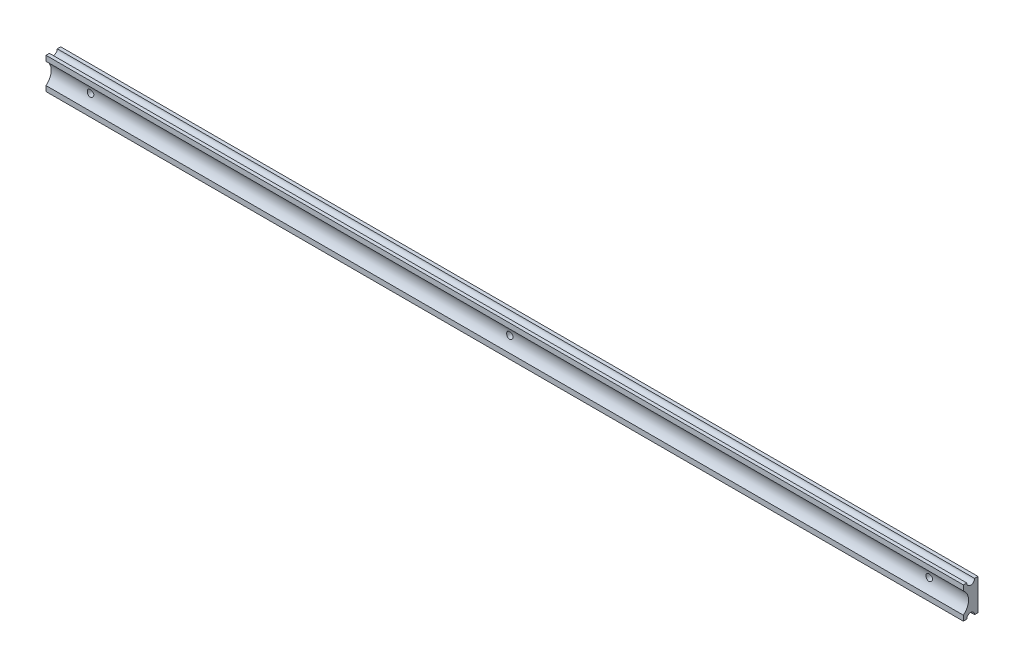
ISO-10303-21;
HEADER;
FILE_DESCRIPTION(('STEP AP214'),'2;1');
FILE_NAME('part.step','',(''),(''),'','','');
FILE_SCHEMA(('AUTOMOTIVE_DESIGN { 1 0 10303 214 1 1 1 1 }'));
ENDSEC;
DATA;
#1=APPLICATION_CONTEXT('core data for automotive mechanical design processes');
#2=APPLICATION_PROTOCOL_DEFINITION('international standard','automotive_design',2000,#1);
#3=PRODUCT_CONTEXT('',#1,'mechanical');
#4=PRODUCT('Part','Part','',(#3));
#5=PRODUCT_RELATED_PRODUCT_CATEGORY('part','',(#4));
#6=PRODUCT_DEFINITION_FORMATION('','',#4);
#7=PRODUCT_DEFINITION_CONTEXT('part definition',#1,'design');
#8=PRODUCT_DEFINITION('design','',#6,#7);
#9=PRODUCT_DEFINITION_SHAPE('','',#8);
#10=(LENGTH_UNIT() NAMED_UNIT(*) SI_UNIT(.MILLI.,.METRE.));
#11=(NAMED_UNIT(*) PLANE_ANGLE_UNIT() SI_UNIT($,.RADIAN.));
#12=(NAMED_UNIT(*) SI_UNIT($,.STERADIAN.) SOLID_ANGLE_UNIT());
#13=UNCERTAINTY_MEASURE_WITH_UNIT(LENGTH_MEASURE(1.E-05),#10,'distance_accuracy_value','');
#14=(GEOMETRIC_REPRESENTATION_CONTEXT(3) GLOBAL_UNCERTAINTY_ASSIGNED_CONTEXT((#13)) GLOBAL_UNIT_ASSIGNED_CONTEXT((#10,
#11,#12)) REPRESENTATION_CONTEXT('',''));
#15=CARTESIAN_POINT('',(0.,0.,0.));
#16=DIRECTION('',(0.,0.,1.));
#17=DIRECTION('',(1.,0.,0.));
#18=AXIS2_PLACEMENT_3D('',#15,#16,#17);
#19=CARTESIAN_POINT('',(175.,-6.,0.));
#20=DIRECTION('',(0.,0.,-1.));
#21=DIRECTION('',(-1.,0.,0.));
#22=AXIS2_PLACEMENT_3D('',#19,#20,#21);
#23=PLANE('',#22);
#24=DIRECTION('',(0.,-1.,0.));
#25=VECTOR('',#24,1.);
#26=CARTESIAN_POINT('',(-175.,-6.,0.));
#27=LINE('',#26,#25);
#28=CARTESIAN_POINT('',(-175.,6.,0.));
#29=VERTEX_POINT('',#28);
#30=CARTESIAN_POINT('',(-175.,4.,0.));
#31=VERTEX_POINT('',#30);
#32=EDGE_CURVE('E195',#29,#31,#27,.T.);
#33=ORIENTED_EDGE('',*,*,#32,.T.);
#34=DIRECTION('',(1.,0.,0.));
#35=VECTOR('',#34,1.);
#36=CARTESIAN_POINT('',(-175.,4.,0.));
#37=LINE('',#36,#35);
#38=CARTESIAN_POINT('',(175.,4.,0.));
#39=VERTEX_POINT('',#38);
#40=EDGE_CURVE('E115',#31,#39,#37,.T.);
#41=ORIENTED_EDGE('',*,*,#40,.T.);
#42=DIRECTION('',(0.,-1.,0.));
#43=VECTOR('',#42,1.);
#44=CARTESIAN_POINT('',(175.,-6.,0.));
#45=LINE('',#44,#43);
#46=CARTESIAN_POINT('',(175.,6.,0.));
#47=VERTEX_POINT('',#46);
#48=EDGE_CURVE('E242',#47,#39,#45,.T.);
#49=ORIENTED_EDGE('',*,*,#48,.F.);
#50=DIRECTION('',(-1.,0.,0.));
#51=VECTOR('',#50,1.);
#52=CARTESIAN_POINT('',(175.,6.,0.));
#53=LINE('',#52,#51);
#54=EDGE_CURVE('E217',#47,#29,#53,.T.);
#55=ORIENTED_EDGE('',*,*,#54,.T.);
#56=EDGE_LOOP('',(#33,#41,#49,#55));
#57=FACE_BOUND('',#56,.T.);
#58=ADVANCED_FACE('F95',(#57),#23,.F.);
#59=CARTESIAN_POINT('',(175.,6.,0.));
#60=DIRECTION('',(0.,-1.,0.));
#61=DIRECTION('',(0.,0.,-1.));
#62=AXIS2_PLACEMENT_3D('',#59,#60,#61);
#63=PLANE('',#62);
#64=DIRECTION('',(0.,0.,1.));
#65=VECTOR('',#64,1.);
#66=CARTESIAN_POINT('',(-175.,6.,0.));
#67=LINE('',#66,#65);
#68=CARTESIAN_POINT('',(-175.,6.,-5.6));
#69=VERTEX_POINT('',#68);
#70=CARTESIAN_POINT('',(-175.,6.,-4.3));
#71=VERTEX_POINT('',#70);
#72=EDGE_CURVE('E196',#69,#71,#67,.T.);
#73=ORIENTED_EDGE('',*,*,#72,.T.);
#74=DIRECTION('',(1.,0.,0.));
#75=VECTOR('',#74,1.);
#76=CARTESIAN_POINT('',(-175.,6.,-4.3));
#77=LINE('',#76,#75);
#78=CARTESIAN_POINT('',(175.,6.,-4.3));
#79=VERTEX_POINT('',#78);
#80=EDGE_CURVE('E227',#71,#79,#77,.T.);
#81=ORIENTED_EDGE('',*,*,#80,.T.);
#82=DIRECTION('',(0.,0.,1.));
#83=VECTOR('',#82,1.);
#84=CARTESIAN_POINT('',(175.,6.,0.));
#85=LINE('',#84,#83);
#86=CARTESIAN_POINT('',(175.,6.,-5.6));
#87=VERTEX_POINT('',#86);
#88=EDGE_CURVE('E240',#87,#79,#85,.T.);
#89=ORIENTED_EDGE('',*,*,#88,.F.);
#90=DIRECTION('',(-1.,0.,0.));
#91=VECTOR('',#90,1.);
#92=CARTESIAN_POINT('',(175.,6.,-5.6));
#93=LINE('',#92,#91);
#94=EDGE_CURVE('E208',#87,#69,#93,.T.);
#95=ORIENTED_EDGE('',*,*,#94,.T.);
#96=EDGE_LOOP('',(#73,#81,#89,#95));
#97=FACE_BOUND('',#96,.T.);
#98=ADVANCED_FACE('F258',(#97),#63,.F.);
#99=CARTESIAN_POINT('',(175.,-6.,-5.6));
#100=DIRECTION('',(0.,1.,0.));
#101=DIRECTION('',(0.,0.,1.));
#102=AXIS2_PLACEMENT_3D('',#99,#100,#101);
#103=PLANE('',#102);
#104=DIRECTION('',(0.,0.,-1.));
#105=VECTOR('',#104,1.);
#106=CARTESIAN_POINT('',(-175.,-6.,-5.6));
#107=LINE('',#106,#105);
#108=CARTESIAN_POINT('',(-175.,-6.,0.));
#109=VERTEX_POINT('',#108);
#110=CARTESIAN_POINT('',(-175.,-6.,-1.3));
#111=VERTEX_POINT('',#110);
#112=EDGE_CURVE('E194',#109,#111,#107,.T.);
#113=ORIENTED_EDGE('',*,*,#112,.T.);
#114=DIRECTION('',(1.,0.,0.));
#115=VECTOR('',#114,1.);
#116=CARTESIAN_POINT('',(-175.,-6.,-1.3));
#117=LINE('',#116,#115);
#118=CARTESIAN_POINT('',(175.,-6.,-1.3));
#119=VERTEX_POINT('',#118);
#120=EDGE_CURVE('E123',#111,#119,#117,.T.);
#121=ORIENTED_EDGE('',*,*,#120,.T.);
#122=DIRECTION('',(0.,0.,-1.));
#123=VECTOR('',#122,1.);
#124=CARTESIAN_POINT('',(175.,-6.,-5.6));
#125=LINE('',#124,#123);
#126=CARTESIAN_POINT('',(175.,-6.,0.));
#127=VERTEX_POINT('',#126);
#128=EDGE_CURVE('E246',#127,#119,#125,.T.);
#129=ORIENTED_EDGE('',*,*,#128,.F.);
#130=DIRECTION('',(-1.,0.,0.));
#131=VECTOR('',#130,1.);
#132=CARTESIAN_POINT('',(175.,-6.,0.));
#133=LINE('',#132,#131);
#134=EDGE_CURVE('E215',#127,#109,#133,.T.);
#135=ORIENTED_EDGE('',*,*,#134,.T.);
#136=EDGE_LOOP('',(#113,#121,#129,#135));
#137=FACE_BOUND('',#136,.T.);
#138=ADVANCED_FACE('F260',(#137),#103,.F.);
#139=CARTESIAN_POINT('',(175.,6.,-1.3));
#140=VERTEX_POINT('',#139);
#141=EDGE_CURVE('E207',#140,#47,#85,.T.);
#142=ORIENTED_EDGE('',*,*,#141,.F.);
#143=DIRECTION('',(1.,0.,0.));
#144=VECTOR('',#143,1.);
#145=CARTESIAN_POINT('',(-175.,6.,-1.3));
#146=LINE('',#145,#144);
#147=CARTESIAN_POINT('',(-175.,6.,-1.3));
#148=VERTEX_POINT('',#147);
#149=EDGE_CURVE('E224',#140,#148,#146,.F.);
#150=ORIENTED_EDGE('',*,*,#149,.T.);
#151=EDGE_CURVE('E200',#148,#29,#67,.T.);
#152=ORIENTED_EDGE('',*,*,#151,.T.);
#153=ORIENTED_EDGE('',*,*,#54,.F.);
#154=EDGE_LOOP('',(#142,#150,#152,#153));
#155=FACE_BOUND('',#154,.T.);
#156=ADVANCED_FACE('F97',(#155),#63,.F.);
#157=CARTESIAN_POINT('',(175.,-4.,0.));
#158=VERTEX_POINT('',#157);
#159=EDGE_CURVE('E188',#158,#127,#45,.T.);
#160=ORIENTED_EDGE('',*,*,#159,.F.);
#161=DIRECTION('',(1.,0.,0.));
#162=VECTOR('',#161,1.);
#163=CARTESIAN_POINT('',(-175.,-4.,0.));
#164=LINE('',#163,#162);
#165=CARTESIAN_POINT('',(-175.,-4.,0.));
#166=VERTEX_POINT('',#165);
#167=EDGE_CURVE('E176',#158,#166,#164,.F.);
#168=ORIENTED_EDGE('',*,*,#167,.T.);
#169=EDGE_CURVE('E186',#166,#109,#27,.T.);
#170=ORIENTED_EDGE('',*,*,#169,.T.);
#171=ORIENTED_EDGE('',*,*,#134,.F.);
#172=EDGE_LOOP('',(#160,#168,#170,#171));
#173=FACE_BOUND('',#172,.T.);
#174=ADVANCED_FACE('F184',(#173),#23,.F.);
#175=CARTESIAN_POINT('',(175.,-6.,-4.3));
#176=VERTEX_POINT('',#175);
#177=CARTESIAN_POINT('',(175.,-6.,-5.6));
#178=VERTEX_POINT('',#177);
#179=EDGE_CURVE('E245',#176,#178,#125,.T.);
#180=ORIENTED_EDGE('',*,*,#179,.F.);
#181=DIRECTION('',(1.,0.,0.));
#182=VECTOR('',#181,1.);
#183=CARTESIAN_POINT('',(-175.,-6.,-4.3));
#184=LINE('',#183,#182);
#185=CARTESIAN_POINT('',(-175.,-6.,-4.3));
#186=VERTEX_POINT('',#185);
#187=EDGE_CURVE('E322',#176,#186,#184,.F.);
#188=ORIENTED_EDGE('',*,*,#187,.T.);
#189=CARTESIAN_POINT('',(-175.,-6.,-5.6));
#190=VERTEX_POINT('',#189);
#191=EDGE_CURVE('E198',#186,#190,#107,.T.);
#192=ORIENTED_EDGE('',*,*,#191,.T.);
#193=DIRECTION('',(-1.,0.,0.));
#194=VECTOR('',#193,1.);
#195=CARTESIAN_POINT('',(175.,-6.,-5.6));
#196=LINE('',#195,#194);
#197=EDGE_CURVE('E211',#178,#190,#196,.T.);
#198=ORIENTED_EDGE('',*,*,#197,.F.);
#199=EDGE_LOOP('',(#180,#188,#192,#198));
#200=FACE_BOUND('',#199,.T.);
#201=ADVANCED_FACE('F267',(#200),#103,.F.);
#202=CARTESIAN_POINT('',(175.,6.,-5.6));
#203=DIRECTION('',(0.,0.,1.));
#204=DIRECTION('',(0.,-1.,0.));
#205=AXIS2_PLACEMENT_3D('',#202,#203,#204);
#206=PLANE('',#205);
#207=CARTESIAN_POINT('',(0.,0.,-5.6));
#208=DIRECTION('',(0.,0.,-1.));
#209=DIRECTION('',(0.,1.,0.));
#210=AXIS2_PLACEMENT_3D('',#207,#208,#209);
#211=CIRCLE('',#210,1.24999999999997);
#212=CARTESIAN_POINT('',(0.,1.24999999999997,-5.6));
#213=VERTEX_POINT('',#212);
#214=EDGE_CURVE('E310',#213,#213,#211,.T.);
#215=ORIENTED_EDGE('',*,*,#214,.F.);
#216=EDGE_LOOP('',(#215));
#217=FACE_BOUND('',#216,.T.);
#218=CARTESIAN_POINT('',(-160.,0.,-5.6));
#219=DIRECTION('',(0.,0.,-1.));
#220=DIRECTION('',(0.,1.,0.));
#221=AXIS2_PLACEMENT_3D('',#218,#219,#220);
#222=CIRCLE('',#221,1.24999999999997);
#223=CARTESIAN_POINT('',(-160.,1.24999999999997,-5.6));
#224=VERTEX_POINT('',#223);
#225=EDGE_CURVE('E311',#224,#224,#222,.T.);
#226=ORIENTED_EDGE('',*,*,#225,.F.);
#227=EDGE_LOOP('',(#226));
#228=FACE_BOUND('',#227,.T.);
#229=CARTESIAN_POINT('',(160.,0.,-5.6));
#230=DIRECTION('',(0.,0.,-1.));
#231=DIRECTION('',(0.,1.,0.));
#232=AXIS2_PLACEMENT_3D('',#229,#230,#231);
#233=CIRCLE('',#232,1.24999999999997);
#234=CARTESIAN_POINT('',(160.,1.24999999999997,-5.6));
#235=VERTEX_POINT('',#234);
#236=EDGE_CURVE('E313',#235,#235,#233,.T.);
#237=ORIENTED_EDGE('',*,*,#236,.F.);
#238=EDGE_LOOP('',(#237));
#239=FACE_BOUND('',#238,.T.);
#240=DIRECTION('',(0.,1.,0.));
#241=VECTOR('',#240,1.);
#242=CARTESIAN_POINT('',(-175.,6.,-5.6));
#243=LINE('',#242,#241);
#244=EDGE_CURVE('E205',#190,#69,#243,.T.);
#245=ORIENTED_EDGE('',*,*,#244,.T.);
#246=ORIENTED_EDGE('',*,*,#94,.F.);
#247=DIRECTION('',(0.,1.,0.));
#248=VECTOR('',#247,1.);
#249=CARTESIAN_POINT('',(175.,6.,-5.6));
#250=LINE('',#249,#248);
#251=EDGE_CURVE('E212',#178,#87,#250,.T.);
#252=ORIENTED_EDGE('',*,*,#251,.F.);
#253=ORIENTED_EDGE('',*,*,#197,.T.);
#254=EDGE_LOOP('',(#245,#246,#252,#253));
#255=FACE_BOUND('',#254,.T.);
#256=ADVANCED_FACE('F256',(#217,#228,#239,#255),#206,.F.);
#257=CARTESIAN_POINT('',(175.,0.,0.));
#258=DIRECTION('',(-1.,0.,0.));
#259=DIRECTION('',(0.,0.,1.));
#260=AXIS2_PLACEMENT_3D('',#257,#258,#259);
#261=PLANE('',#260);
#262=ORIENTED_EDGE('',*,*,#48,.T.);
#263=CARTESIAN_POINT('',(175.,0.,3.));
#264=DIRECTION('',(1.,0.,0.));
#265=DIRECTION('',(0.,0.,-1.));
#266=AXIS2_PLACEMENT_3D('',#263,#264,#265);
#267=CIRCLE('',#266,5.);
#268=EDGE_CURVE('E189',#158,#39,#267,.T.);
#269=ORIENTED_EDGE('',*,*,#268,.F.);
#270=ORIENTED_EDGE('',*,*,#159,.T.);
#271=ORIENTED_EDGE('',*,*,#128,.T.);
#272=CARTESIAN_POINT('',(175.,-6.,-2.8));
#273=DIRECTION('',(1.,0.,0.));
#274=DIRECTION('',(0.,0.,-1.));
#275=AXIS2_PLACEMENT_3D('',#272,#273,#274);
#276=CIRCLE('',#275,1.5);
#277=EDGE_CURVE('E319',#176,#119,#276,.T.);
#278=ORIENTED_EDGE('',*,*,#277,.F.);
#279=ORIENTED_EDGE('',*,*,#179,.T.);
#280=ORIENTED_EDGE('',*,*,#251,.T.);
#281=ORIENTED_EDGE('',*,*,#88,.T.);
#282=CARTESIAN_POINT('',(175.,6.,-2.8));
#283=DIRECTION('',(1.,0.,0.));
#284=DIRECTION('',(0.,0.,-1.));
#285=AXIS2_PLACEMENT_3D('',#282,#283,#284);
#286=CIRCLE('',#285,1.5);
#287=EDGE_CURVE('E320',#140,#79,#286,.T.);
#288=ORIENTED_EDGE('',*,*,#287,.F.);
#289=ORIENTED_EDGE('',*,*,#141,.T.);
#290=EDGE_LOOP('',(#262,#269,#270,#271,#278,#279,#280,#281,#288,#289));
#291=FACE_BOUND('',#290,.T.);
#292=ADVANCED_FACE('F251',(#291),#261,.F.);
#293=CARTESIAN_POINT('',(-175.,0.,0.));
#294=DIRECTION('',(-1.,0.,0.));
#295=DIRECTION('',(0.,0.,1.));
#296=AXIS2_PLACEMENT_3D('',#293,#294,#295);
#297=PLANE('',#296);
#298=CARTESIAN_POINT('',(-175.,0.,3.));
#299=DIRECTION('',(-1.,0.,0.));
#300=DIRECTION('',(0.,0.,1.));
#301=AXIS2_PLACEMENT_3D('',#298,#299,#300);
#302=CIRCLE('',#301,5.);
#303=EDGE_CURVE('E49',#31,#166,#302,.T.);
#304=ORIENTED_EDGE('',*,*,#303,.F.);
#305=ORIENTED_EDGE('',*,*,#32,.F.);
#306=ORIENTED_EDGE('',*,*,#151,.F.);
#307=CARTESIAN_POINT('',(-175.,6.,-2.8));
#308=DIRECTION('',(-1.,0.,0.));
#309=DIRECTION('',(0.,0.,1.));
#310=AXIS2_PLACEMENT_3D('',#307,#308,#309);
#311=CIRCLE('',#310,1.5);
#312=EDGE_CURVE('E109',#71,#148,#311,.T.);
#313=ORIENTED_EDGE('',*,*,#312,.F.);
#314=ORIENTED_EDGE('',*,*,#72,.F.);
#315=ORIENTED_EDGE('',*,*,#244,.F.);
#316=ORIENTED_EDGE('',*,*,#191,.F.);
#317=CARTESIAN_POINT('',(-175.,-6.,-2.8));
#318=DIRECTION('',(1.,0.,0.));
#319=DIRECTION('',(0.,0.,-1.));
#320=AXIS2_PLACEMENT_3D('',#317,#318,#319);
#321=CIRCLE('',#320,1.5);
#322=EDGE_CURVE('E323',#186,#111,#321,.T.);
#323=ORIENTED_EDGE('',*,*,#322,.T.);
#324=ORIENTED_EDGE('',*,*,#112,.F.);
#325=ORIENTED_EDGE('',*,*,#169,.F.);
#326=EDGE_LOOP('',(#304,#305,#306,#313,#314,#315,#316,#323,#324,#325));
#327=FACE_BOUND('',#326,.T.);
#328=ADVANCED_FACE('F192',(#327),#297,.T.);
#329=CARTESIAN_POINT('',(-175.,-6.,-2.8));
#330=DIRECTION('',(1.,0.,0.));
#331=DIRECTION('',(0.,0.,-1.));
#332=AXIS2_PLACEMENT_3D('',#329,#330,#331);
#333=CYLINDRICAL_SURFACE('',#332,1.5);
#334=ORIENTED_EDGE('',*,*,#322,.F.);
#335=ORIENTED_EDGE('',*,*,#187,.F.);
#336=ORIENTED_EDGE('',*,*,#277,.T.);
#337=ORIENTED_EDGE('',*,*,#120,.F.);
#338=EDGE_LOOP('',(#334,#335,#336,#337));
#339=FACE_BOUND('',#338,.T.);
#340=ADVANCED_FACE('F283',(#339),#333,.F.);
#341=CARTESIAN_POINT('',(-175.,6.,-2.8));
#342=DIRECTION('',(1.,0.,0.));
#343=DIRECTION('',(0.,0.,-1.));
#344=AXIS2_PLACEMENT_3D('',#341,#342,#343);
#345=CYLINDRICAL_SURFACE('',#344,1.5);
#346=ORIENTED_EDGE('',*,*,#312,.T.);
#347=ORIENTED_EDGE('',*,*,#149,.F.);
#348=ORIENTED_EDGE('',*,*,#287,.T.);
#349=ORIENTED_EDGE('',*,*,#80,.F.);
#350=EDGE_LOOP('',(#346,#347,#348,#349));
#351=FACE_BOUND('',#350,.T.);
#352=ADVANCED_FACE('F223',(#351),#345,.F.);
#353=CARTESIAN_POINT('',(-175.,0.,3.));
#354=DIRECTION('',(1.,0.,0.));
#355=DIRECTION('',(0.,0.,-1.));
#356=AXIS2_PLACEMENT_3D('',#353,#354,#355);
#357=CYLINDRICAL_SURFACE('',#356,5.);
#358=CARTESIAN_POINT('',(0.,1.24999999999999,-1.84122918275928));
#359=CARTESIAN_POINT('',(0.0690253754622762,1.24999803929588,-1.84123050042654));
#360=CARTESIAN_POINT('',(0.138072449338968,1.24426312274864,-1.84272153006957));
#361=CARTESIAN_POINT('',(0.274183789086987,1.22151156273206,-1.84850930996625));
#362=CARTESIAN_POINT('',(0.341246877234131,1.20448835337109,-1.85280769310907));
#363=CARTESIAN_POINT('',(0.471401769093487,1.15974559981596,-1.86369362297984));
#364=CARTESIAN_POINT('',(0.534498577692802,1.13203986392722,-1.87027821345205));
#365=CARTESIAN_POINT('',(0.655155426269927,1.06676057063069,-1.88499096014404));
#366=CARTESIAN_POINT('',(0.71271523104008,1.02918659428033,-1.89311918189251));
#367=CARTESIAN_POINT('',(0.821930822631068,0.944354213655925,-1.91020358177806));
#368=CARTESIAN_POINT('',(0.873446800174988,0.896918443852012,-1.91917298811516));
#369=CARTESIAN_POINT('',(0.967880697180139,0.794091032050319,-1.93681437757649));
#370=CARTESIAN_POINT('',(1.01079781281084,0.73869864709014,-1.94548633283195));
#371=CARTESIAN_POINT('',(1.08738773381561,0.620572600539462,-1.96170207760291));
#372=CARTESIAN_POINT('',(1.1209231940807,0.557747288097545,-1.96922843700296));
#373=CARTESIAN_POINT('',(1.17690482207651,0.427131592146369,-1.98215405962992));
#374=CARTESIAN_POINT('',(1.19935262595773,0.359341942895962,-1.98755363667172));
#375=CARTESIAN_POINT('',(1.23207391728926,0.222179379377077,-1.9955237942409));
#376=CARTESIAN_POINT('',(1.24258482216325,0.152866359774484,-1.99814946922157));
#377=CARTESIAN_POINT('',(1.25187918963773,0.0134144096313832,-2.00046797053649));
#378=CARTESIAN_POINT('',(1.25066438610475,-0.056724397269034,-2.00016123048352));
#379=CARTESIAN_POINT('',(1.23671257487488,-0.194190308965483,-1.99669047476767));
#380=CARTESIAN_POINT('',(1.22423183747303,-0.261545269501332,-1.99359001170437));
#381=CARTESIAN_POINT('',(1.18851436497571,-0.393172809267106,-1.98495418262427));
#382=CARTESIAN_POINT('',(1.16527705731126,-0.457445224213044,-1.97941868699221));
#383=CARTESIAN_POINT('',(1.10849871465643,-0.581758379377255,-1.96643754850448));
#384=CARTESIAN_POINT('',(1.07486647766909,-0.641755637208128,-1.95897509847527));
#385=CARTESIAN_POINT('',(0.998322160441827,-0.755344527925607,-1.94294951904825));
#386=CARTESIAN_POINT('',(0.955408465719641,-0.808935043856875,-1.93438619826245));
#387=CARTESIAN_POINT('',(0.860145629008761,-0.909717543856188,-1.9168185688476));
#388=CARTESIAN_POINT('',(0.807572553826068,-0.956697098843994,-1.90780859762959));
#389=CARTESIAN_POINT('',(0.695200013229834,-1.04122046995377,-1.89057521758353));
#390=CARTESIAN_POINT('',(0.63540021025446,-1.07876384505751,-1.88235184552985));
#391=CARTESIAN_POINT('',(0.509854982925479,-1.14348516127824,-1.86760248415824));
#392=CARTESIAN_POINT('',(0.444082134843364,-1.1706119587131,-1.86108491862861));
#393=CARTESIAN_POINT('',(0.308707265961736,-1.21335702579542,-1.85059320069979));
#394=CARTESIAN_POINT('',(0.239106068008393,-1.22897775819113,-1.8466185040511));
#395=CARTESIAN_POINT('',(0.100020249238406,-1.24791481933258,-1.84177678019571));
#396=CARTESIAN_POINT('',(0.0305811033351569,-1.2515452369598,-1.84083044546824));
#397=CARTESIAN_POINT('',(-0.107910968289097,-1.24725849525776,-1.8419367174052));
#398=CARTESIAN_POINT('',(-0.176963928975632,-1.23934239892439,-1.84398904800633));
#399=CARTESIAN_POINT('',(-0.311557132477361,-1.21246273196882,-1.85078540977281));
#400=CARTESIAN_POINT('',(-0.37713636328543,-1.19368203414086,-1.85548485117188));
#401=CARTESIAN_POINT('',(-0.504215728925852,-1.1458090408353,-1.86700359135481));
#402=CARTESIAN_POINT('',(-0.565715379527681,-1.11671552385626,-1.87382314124307));
#403=CARTESIAN_POINT('',(-0.684220638933688,-1.04838533396827,-1.88898068546632));
#404=CARTESIAN_POINT('',(-0.741114420021567,-1.0089608769178,-1.89734584303321));
#405=CARTESIAN_POINT('',(-0.847594181400698,-0.921325366168061,-1.91458541535858));
#406=CARTESIAN_POINT('',(-0.897178958325061,-0.873112868506792,-1.92345991364235));
#407=CARTESIAN_POINT('',(-0.988905521285502,-0.7678284012309,-1.94098701515803));
#408=CARTESIAN_POINT('',(-1.03083003127443,-0.710564940664483,-1.94962851030918));
#409=CARTESIAN_POINT('',(-1.10446793347564,-0.589628353368334,-1.96548608306867));
#410=CARTESIAN_POINT('',(-1.13618185830411,-0.525955561196977,-1.9727022350198));
#411=CARTESIAN_POINT('',(-1.18822301726398,-0.39444775216385,-1.98485057869157));
#412=CARTESIAN_POINT('',(-1.20863214218955,-0.326646726284839,-1.98979915011205));
#413=CARTESIAN_POINT('',(-1.23773016730423,-0.188437200398498,-1.99692646697894));
#414=CARTESIAN_POINT('',(-1.24642132936954,-0.118029206301543,-1.99910574696704));
#415=CARTESIAN_POINT('',(-1.25170948696943,0.0213544080541679,-2.00042711761014));
#416=CARTESIAN_POINT('',(-1.24862713636926,0.0903172837075495,-1.9996497360001));
#417=CARTESIAN_POINT('',(-1.2311902158821,0.226709370518428,-1.9953237057178));
#418=CARTESIAN_POINT('',(-1.21683598123363,0.29413862722611,-1.99177513946369));
#419=CARTESIAN_POINT('',(-1.17743472528634,0.425213794556018,-1.98231791067453));
#420=CARTESIAN_POINT('',(-1.15244568335673,0.48887811822627,-1.97642205628333));
#421=CARTESIAN_POINT('',(-1.09253677622586,0.61114631630183,-1.9628911114173));
#422=CARTESIAN_POINT('',(-1.05761565916307,0.669749551581308,-1.9552558017217));
#423=CARTESIAN_POINT('',(-0.977855957503687,0.781752410529868,-1.93884062101666));
#424=CARTESIAN_POINT('',(-0.9327998213658,0.834993735375724,-1.93003771182014));
#425=CARTESIAN_POINT('',(-0.834471435032762,0.933268775339063,-1.91238311316553));
#426=CARTESIAN_POINT('',(-0.781197104877622,0.978300406335232,-1.90353141190695));
#427=CARTESIAN_POINT('',(-0.666748232248338,1.05970253309903,-1.88659344825685));
#428=CARTESIAN_POINT('',(-0.605444845734225,1.09589577430818,-1.87852454662356));
#429=CARTESIAN_POINT('',(-0.477430637596644,1.15740862076957,-1.8642994443827));
#430=CARTESIAN_POINT('',(-0.410723792366597,1.18273613719963,-1.85814185308379));
#431=CARTESIAN_POINT('',(-0.286778735216634,1.21802816070678,-1.8493988592473));
#432=CARTESIAN_POINT('',(-0.230133544520203,1.22999146324421,-1.84635828750684));
#433=CARTESIAN_POINT('',(-0.115663913750074,1.24597786571657,-1.84227298231966));
#434=CARTESIAN_POINT('',(-0.0578395746937013,1.25000164296522,-1.84122807862454));
#435=CARTESIAN_POINT('',(0.,1.24999999999999,-1.84122918275928));
#436=B_SPLINE_CURVE_WITH_KNOTS('',3,(#358,#359,#360,#361,#362,#363,#364,#365,#366,#367,#368,
#369,#370,#371,#372,#373,#374,#375,#376,#377,#378,#379,#380,#381,#382,#383,#384,#385,#386,#387,
#388,#389,#390,#391,#392,#393,#394,#395,#396,#397,#398,#399,#400,#401,#402,#403,#404,#405,#406,
#407,#408,#409,#410,#411,#412,#413,#414,#415,#416,#417,#418,#419,#420,#421,#422,#423,#424,#425,
#426,#427,#428,#429,#430,#431,#432,#433,#434,#435),.UNSPECIFIED.,.T.,.F.,(4,2,2,2,2,2,2,2,2,2,2,
2,2,2,2,2,2,2,2,2,2,2,2,2,2,2,2,2,2,2,2,2,2,2,2,2,2,2,4),(0.,0.206863720868065,
0.413847870714328,0.620565363583005,0.827291633777386,1.03811977096488,1.24896760739933,
1.46275748198959,1.67651579923545,1.88594375497672,2.09534074333008,2.30009131344472,
2.50485278362391,2.7114643712722,2.91811192734455,3.13035233285954,3.34260265599898,
3.55588216004198,3.76911600064771,3.97671787380854,4.18430063591895,4.38848702504597,
4.59269760710703,4.80091422929574,5.00916509442517,5.22262665482654,5.43607707859771,
5.6479603640346,5.85980274454514,6.06591723063723,6.27202558688485,6.47702438279849,
6.68204902869028,6.89198548291029,7.10197515782749,7.31588238642332,7.52963360683301,
7.70298913588656,7.87632987549752),.UNSPECIFIED.);
#437=CARTESIAN_POINT('',(0.,1.24999999999999,-1.84122918275928));
#438=VERTEX_POINT('',#437);
#439=EDGE_CURVE('E316',#438,#438,#436,.T.);
#440=ORIENTED_EDGE('',*,*,#439,.T.);
#441=EDGE_LOOP('',(#440));
#442=FACE_BOUND('',#441,.T.);
#443=CARTESIAN_POINT('',(-160.,1.24999999999999,-1.84122918275928));
#444=CARTESIAN_POINT('',(-159.930974624538,1.24999803929588,-1.84123050042655));
#445=CARTESIAN_POINT('',(-159.861927550661,1.24426312274864,-1.84272153006957));
#446=CARTESIAN_POINT('',(-159.725816210913,1.22151156273206,-1.84850930996625));
#447=CARTESIAN_POINT('',(-159.658753122766,1.20448835337109,-1.85280769310907));
#448=CARTESIAN_POINT('',(-159.528598230907,1.15974559981596,-1.86369362297984));
#449=CARTESIAN_POINT('',(-159.465501422307,1.13203986392722,-1.87027821345205));
#450=CARTESIAN_POINT('',(-159.34484457373,1.06676057063069,-1.88499096014404));
#451=CARTESIAN_POINT('',(-159.28728476896,1.02918659428033,-1.89311918189251));
#452=CARTESIAN_POINT('',(-159.178069177369,0.944354213655927,-1.91020358177806));
#453=CARTESIAN_POINT('',(-159.126553199825,0.896918443852019,-1.91917298811515));
#454=CARTESIAN_POINT('',(-159.03211930282,0.794091032050326,-1.93681437757649));
#455=CARTESIAN_POINT('',(-158.989202187189,0.738698647090143,-1.94548633283195));
#456=CARTESIAN_POINT('',(-158.912612266184,0.620572600539462,-1.96170207760291));
#457=CARTESIAN_POINT('',(-158.879076805919,0.557747288097545,-1.96922843700296));
#458=CARTESIAN_POINT('',(-158.823095177924,0.427131592146371,-1.98215405962992));
#459=CARTESIAN_POINT('',(-158.800647374042,0.359341942895964,-1.98755363667172));
#460=CARTESIAN_POINT('',(-158.767926082711,0.222179379377078,-1.9955237942409));
#461=CARTESIAN_POINT('',(-158.757415177837,0.152866359774485,-1.99814946922157));
#462=CARTESIAN_POINT('',(-158.748120810362,0.0134144096313832,-2.00046797053649));
#463=CARTESIAN_POINT('',(-158.749335613895,-0.0567243972690333,-2.00016123048352));
#464=CARTESIAN_POINT('',(-158.763287425125,-0.194190308965484,-1.99669047476767));
#465=CARTESIAN_POINT('',(-158.775768162527,-0.261545269501337,-1.99359001170437));
#466=CARTESIAN_POINT('',(-158.811485635024,-0.393172809267111,-1.98495418262427));
#467=CARTESIAN_POINT('',(-158.834722942689,-0.457445224213046,-1.97941868699221));
#468=CARTESIAN_POINT('',(-158.891501285344,-0.581758379377256,-1.96643754850448));
#469=CARTESIAN_POINT('',(-158.925133522331,-0.64175563720813,-1.95897509847527));
#470=CARTESIAN_POINT('',(-159.001677839558,-0.755344527925608,-1.94294951904825));
#471=CARTESIAN_POINT('',(-159.04459153428,-0.808935043856875,-1.93438619826245));
#472=CARTESIAN_POINT('',(-159.139854370991,-0.909717543856184,-1.9168185688476));
#473=CARTESIAN_POINT('',(-159.192427446174,-0.956697098843989,-1.90780859762959));
#474=CARTESIAN_POINT('',(-159.30479998677,-1.04122046995377,-1.89057521758353));
#475=CARTESIAN_POINT('',(-159.364599789746,-1.07876384505751,-1.88235184552986));
#476=CARTESIAN_POINT('',(-159.490145017075,-1.14348516127823,-1.86760248415825));
#477=CARTESIAN_POINT('',(-159.555917865157,-1.1706119587131,-1.86108491862861));
#478=CARTESIAN_POINT('',(-159.691292734038,-1.21335702579541,-1.85059320069979));
#479=CARTESIAN_POINT('',(-159.760893931992,-1.22897775819113,-1.8466185040511));
#480=CARTESIAN_POINT('',(-159.899979750762,-1.24791481933258,-1.84177678019571));
#481=CARTESIAN_POINT('',(-159.969418896665,-1.2515452369598,-1.84083044546824));
#482=CARTESIAN_POINT('',(-160.107910968289,-1.24725849525776,-1.8419367174052));
#483=CARTESIAN_POINT('',(-160.176963928976,-1.23934239892439,-1.84398904800633));
#484=CARTESIAN_POINT('',(-160.311557132477,-1.21246273196882,-1.85078540977281));
#485=CARTESIAN_POINT('',(-160.377136363285,-1.19368203414086,-1.85548485117188));
#486=CARTESIAN_POINT('',(-160.504215728926,-1.1458090408353,-1.86700359135482));
#487=CARTESIAN_POINT('',(-160.565715379528,-1.11671552385626,-1.87382314124307));
#488=CARTESIAN_POINT('',(-160.684220638934,-1.04838533396827,-1.88898068546632));
#489=CARTESIAN_POINT('',(-160.741114420022,-1.0089608769178,-1.89734584303321));
#490=CARTESIAN_POINT('',(-160.847594181401,-0.921325366168058,-1.91458541535858));
#491=CARTESIAN_POINT('',(-160.897178958325,-0.873112868506789,-1.92345991364235));
#492=CARTESIAN_POINT('',(-160.988905521285,-0.7678284012309,-1.94098701515803));
#493=CARTESIAN_POINT('',(-161.030830031274,-0.710564940664485,-1.94962851030918));
#494=CARTESIAN_POINT('',(-161.104467933476,-0.589628353368337,-1.96548608306867));
#495=CARTESIAN_POINT('',(-161.136181858304,-0.525955561196979,-1.9727022350198));
#496=CARTESIAN_POINT('',(-161.188223017264,-0.39444775216385,-1.98485057869157));
#497=CARTESIAN_POINT('',(-161.20863214219,-0.326646726284838,-1.98979915011205));
#498=CARTESIAN_POINT('',(-161.237730167304,-0.188437200398497,-1.99692646697894));
#499=CARTESIAN_POINT('',(-161.24642132937,-0.118029206301542,-1.99910574696704));
#500=CARTESIAN_POINT('',(-161.251709486969,0.0213544080541674,-2.00042711761014));
#501=CARTESIAN_POINT('',(-161.248627136369,0.0903172837075491,-1.9996497360001));
#502=CARTESIAN_POINT('',(-161.231190215882,0.226709370518427,-1.9953237057178));
#503=CARTESIAN_POINT('',(-161.216835981234,0.294138627226108,-1.99177513946369));
#504=CARTESIAN_POINT('',(-161.177434725286,0.425213794556019,-1.98231791067453));
#505=CARTESIAN_POINT('',(-161.152445683357,0.488878118226275,-1.97642205628333));
#506=CARTESIAN_POINT('',(-161.092536776226,0.611146316301834,-1.9628911114173));
#507=CARTESIAN_POINT('',(-161.057615659163,0.669749551581308,-1.9552558017217));
#508=CARTESIAN_POINT('',(-160.977855957504,0.781752410529867,-1.93884062101666));
#509=CARTESIAN_POINT('',(-160.932799821366,0.834993735375726,-1.93003771182014));
#510=CARTESIAN_POINT('',(-160.834471435033,0.933268775339066,-1.91238311316553));
#511=CARTESIAN_POINT('',(-160.781197104878,0.978300406335233,-1.90353141190695));
#512=CARTESIAN_POINT('',(-160.666748232248,1.05970253309903,-1.88659344825685));
#513=CARTESIAN_POINT('',(-160.605444845734,1.09589577430818,-1.87852454662356));
#514=CARTESIAN_POINT('',(-160.477430637597,1.15740862076957,-1.8642994443827));
#515=CARTESIAN_POINT('',(-160.410723792367,1.18273613719963,-1.85814185308379));
#516=CARTESIAN_POINT('',(-160.286778735217,1.21802816070678,-1.8493988592473));
#517=CARTESIAN_POINT('',(-160.23013354452,1.22999146324421,-1.84635828750684));
#518=CARTESIAN_POINT('',(-160.11566391375,1.24597786571657,-1.84227298231966));
#519=CARTESIAN_POINT('',(-160.057839574694,1.25000164296522,-1.84122807862454));
#520=CARTESIAN_POINT('',(-160.,1.24999999999999,-1.84122918275928));
#521=B_SPLINE_CURVE_WITH_KNOTS('',3,(#443,#444,#445,#446,#447,#448,#449,#450,#451,#452,#453,
#454,#455,#456,#457,#458,#459,#460,#461,#462,#463,#464,#465,#466,#467,#468,#469,#470,#471,#472,
#473,#474,#475,#476,#477,#478,#479,#480,#481,#482,#483,#484,#485,#486,#487,#488,#489,#490,#491,
#492,#493,#494,#495,#496,#497,#498,#499,#500,#501,#502,#503,#504,#505,#506,#507,#508,#509,#510,
#511,#512,#513,#514,#515,#516,#517,#518,#519,#520),.UNSPECIFIED.,.T.,.F.,(4,2,2,2,2,2,2,2,2,2,2,
2,2,2,2,2,2,2,2,2,2,2,2,2,2,2,2,2,2,2,2,2,2,2,2,2,2,2,4),(0.,0.206863720868061,
0.413847870714328,0.620565363583012,0.827291633777386,1.03811977096487,1.24896760739933,
1.46275748198959,1.67651579923545,1.88594375497671,2.09534074333008,2.30009131344472,
2.50485278362391,2.71146437127221,2.91811192734455,3.13035233285951,3.34260265599898,
3.55588216004197,3.76911600064771,3.97671787380854,4.18430063591895,4.388487025046,
4.59269760710703,4.80091422929575,5.00916509442518,5.22262665482654,5.43607707859772,
5.6479603640346,5.85980274454514,6.06591723063722,6.27202558688485,6.47702438279849,
6.68204902869028,6.89198548291029,7.10197515782749,7.31588238642332,7.52963360683302,
7.70298913588653,7.87632987549752),.UNSPECIFIED.);
#522=CARTESIAN_POINT('',(-160.,1.24999999999999,-1.84122918275928));
#523=VERTEX_POINT('',#522);
#524=EDGE_CURVE('E303',#523,#523,#521,.T.);
#525=ORIENTED_EDGE('',*,*,#524,.T.);
#526=EDGE_LOOP('',(#525));
#527=FACE_BOUND('',#526,.T.);
#528=CARTESIAN_POINT('',(160.,1.24999999999999,-1.84122918275928));
#529=CARTESIAN_POINT('',(160.069025375462,1.24999803929588,-1.84123050042655));
#530=CARTESIAN_POINT('',(160.138072449339,1.24426312274864,-1.84272153006957));
#531=CARTESIAN_POINT('',(160.274183789087,1.22151156273206,-1.84850930996625));
#532=CARTESIAN_POINT('',(160.341246877234,1.20448835337109,-1.85280769310907));
#533=CARTESIAN_POINT('',(160.471401769093,1.15974559981596,-1.86369362297984));
#534=CARTESIAN_POINT('',(160.534498577693,1.13203986392722,-1.87027821345205));
#535=CARTESIAN_POINT('',(160.65515542627,1.06676057063069,-1.88499096014404));
#536=CARTESIAN_POINT('',(160.71271523104,1.02918659428033,-1.89311918189251));
#537=CARTESIAN_POINT('',(160.821930822631,0.944354213655927,-1.91020358177806));
#538=CARTESIAN_POINT('',(160.873446800175,0.896918443852019,-1.91917298811515));
#539=CARTESIAN_POINT('',(160.96788069718,0.794091032050326,-1.93681437757649));
#540=CARTESIAN_POINT('',(161.010797812811,0.738698647090143,-1.94548633283195));
#541=CARTESIAN_POINT('',(161.087387733816,0.620572600539462,-1.96170207760291));
#542=CARTESIAN_POINT('',(161.120923194081,0.557747288097545,-1.96922843700296));
#543=CARTESIAN_POINT('',(161.176904822076,0.427131592146371,-1.98215405962992));
#544=CARTESIAN_POINT('',(161.199352625958,0.359341942895964,-1.98755363667172));
#545=CARTESIAN_POINT('',(161.232073917289,0.222179379377078,-1.9955237942409));
#546=CARTESIAN_POINT('',(161.242584822163,0.152866359774485,-1.99814946922157));
#547=CARTESIAN_POINT('',(161.251879189638,0.0134144096313833,-2.00046797053649));
#548=CARTESIAN_POINT('',(161.250664386105,-0.0567243972690332,-2.00016123048352));
#549=CARTESIAN_POINT('',(161.236712574875,-0.194190308965485,-1.99669047476767));
#550=CARTESIAN_POINT('',(161.224231837473,-0.261545269501338,-1.99359001170437));
#551=CARTESIAN_POINT('',(161.188514364976,-0.39317280926711,-1.98495418262427));
#552=CARTESIAN_POINT('',(161.165277057311,-0.457445224213044,-1.97941868699221));
#553=CARTESIAN_POINT('',(161.108498714656,-0.58175837937725,-1.96643754850448));
#554=CARTESIAN_POINT('',(161.074866477669,-0.641755637208123,-1.95897509847527));
#555=CARTESIAN_POINT('',(160.998322160442,-0.755344527925604,-1.94294951904825));
#556=CARTESIAN_POINT('',(160.95540846572,-0.808935043856873,-1.93438619826245));
#557=CARTESIAN_POINT('',(160.860145629009,-0.909717543856193,-1.9168185688476));
#558=CARTESIAN_POINT('',(160.807572553826,-0.956697098844005,-1.90780859762959));
#559=CARTESIAN_POINT('',(160.69520001323,-1.04122046995378,-1.89057521758353));
#560=CARTESIAN_POINT('',(160.635400210254,-1.07876384505752,-1.88235184552985));
#561=CARTESIAN_POINT('',(160.509854982926,-1.14348516127824,-1.86760248415824));
#562=CARTESIAN_POINT('',(160.444082134843,-1.1706119587131,-1.86108491862861));
#563=CARTESIAN_POINT('',(160.308707265962,-1.21335702579541,-1.85059320069979));
#564=CARTESIAN_POINT('',(160.239106068008,-1.22897775819113,-1.8466185040511));
#565=CARTESIAN_POINT('',(160.100020249238,-1.24791481933258,-1.84177678019571));
#566=CARTESIAN_POINT('',(160.030581103335,-1.2515452369598,-1.84083044546824));
#567=CARTESIAN_POINT('',(159.892089031711,-1.24725849525776,-1.8419367174052));
#568=CARTESIAN_POINT('',(159.823036071024,-1.23934239892439,-1.84398904800633));
#569=CARTESIAN_POINT('',(159.688442867523,-1.21246273196882,-1.85078540977281));
#570=CARTESIAN_POINT('',(159.622863636715,-1.19368203414087,-1.85548485117188));
#571=CARTESIAN_POINT('',(159.495784271074,-1.14580904083531,-1.86700359135481));
#572=CARTESIAN_POINT('',(159.434284620472,-1.11671552385627,-1.87382314124307));
#573=CARTESIAN_POINT('',(159.315779361066,-1.04838533396827,-1.88898068546632));
#574=CARTESIAN_POINT('',(159.258885579978,-1.0089608769178,-1.89734584303321));
#575=CARTESIAN_POINT('',(159.152405818599,-0.921325366168058,-1.91458541535858));
#576=CARTESIAN_POINT('',(159.102821041675,-0.873112868506789,-1.92345991364235));
#577=CARTESIAN_POINT('',(159.011094478715,-0.7678284012309,-1.94098701515803));
#578=CARTESIAN_POINT('',(158.969169968726,-0.710564940664485,-1.94962851030918));
#579=CARTESIAN_POINT('',(158.895532066524,-0.589628353368337,-1.96548608306867));
#580=CARTESIAN_POINT('',(158.863818141696,-0.525955561196979,-1.9727022350198));
#581=CARTESIAN_POINT('',(158.811776982736,-0.39444775216385,-1.98485057869157));
#582=CARTESIAN_POINT('',(158.79136785781,-0.326646726284838,-1.98979915011205));
#583=CARTESIAN_POINT('',(158.762269832696,-0.188437200398497,-1.99692646697894));
#584=CARTESIAN_POINT('',(158.75357867063,-0.118029206301542,-1.99910574696704));
#585=CARTESIAN_POINT('',(158.748290513031,0.0213544080541674,-2.00042711761014));
#586=CARTESIAN_POINT('',(158.751372863631,0.0903172837075491,-1.9996497360001));
#587=CARTESIAN_POINT('',(158.768809784118,0.226709370518427,-1.9953237057178));
#588=CARTESIAN_POINT('',(158.783164018766,0.294138627226108,-1.99177513946369));
#589=CARTESIAN_POINT('',(158.822565274714,0.425213794556019,-1.98231791067453));
#590=CARTESIAN_POINT('',(158.847554316643,0.488878118226275,-1.97642205628333));
#591=CARTESIAN_POINT('',(158.907463223774,0.611146316301834,-1.9628911114173));
#592=CARTESIAN_POINT('',(158.942384340837,0.669749551581308,-1.9552558017217));
#593=CARTESIAN_POINT('',(159.022144042496,0.781752410529867,-1.93884062101666));
#594=CARTESIAN_POINT('',(159.067200178634,0.834993735375726,-1.93003771182014));
#595=CARTESIAN_POINT('',(159.165528564967,0.933268775339066,-1.91238311316553));
#596=CARTESIAN_POINT('',(159.218802895122,0.978300406335233,-1.90353141190695));
#597=CARTESIAN_POINT('',(159.333251767752,1.05970253309903,-1.88659344825685));
#598=CARTESIAN_POINT('',(159.394555154266,1.09589577430818,-1.87852454662356));
#599=CARTESIAN_POINT('',(159.522569362403,1.15740862076957,-1.8642994443827));
#600=CARTESIAN_POINT('',(159.589276207633,1.18273613719963,-1.85814185308379));
#601=CARTESIAN_POINT('',(159.713221264783,1.21802816070678,-1.8493988592473));
#602=CARTESIAN_POINT('',(159.76986645548,1.22999146324421,-1.84635828750684));
#603=CARTESIAN_POINT('',(159.88433608625,1.24597786571657,-1.84227298231966));
#604=CARTESIAN_POINT('',(159.942160425306,1.25000164296522,-1.84122807862454));
#605=CARTESIAN_POINT('',(160.,1.24999999999999,-1.84122918275928));
#606=B_SPLINE_CURVE_WITH_KNOTS('',3,(#528,#529,#530,#531,#532,#533,#534,#535,#536,#537,#538,
#539,#540,#541,#542,#543,#544,#545,#546,#547,#548,#549,#550,#551,#552,#553,#554,#555,#556,#557,
#558,#559,#560,#561,#562,#563,#564,#565,#566,#567,#568,#569,#570,#571,#572,#573,#574,#575,#576,
#577,#578,#579,#580,#581,#582,#583,#584,#585,#586,#587,#588,#589,#590,#591,#592,#593,#594,#595,
#596,#597,#598,#599,#600,#601,#602,#603,#604,#605),.UNSPECIFIED.,.T.,.F.,(4,2,2,2,2,2,2,2,2,2,2,
2,2,2,2,2,2,2,2,2,2,2,2,2,2,2,2,2,2,2,2,2,2,2,2,2,2,2,4),(0.,0.206863720868061,
0.413847870714328,0.620565363583012,0.827291633777386,1.03811977096487,1.24896760739933,
1.46275748198959,1.67651579923545,1.88594375497671,2.09534074333008,2.30009131344472,
2.50485278362391,2.71146437127218,2.91811192734455,3.13035233285957,3.34260265599898,
3.55588216004197,3.76911600064771,3.97671787380854,4.18430063591895,4.38848702504595,
4.59269760710703,4.80091422929575,5.00916509442518,5.22262665482654,5.43607707859772,
5.6479603640346,5.85980274454514,6.06591723063723,6.27202558688485,6.47702438279849,
6.68204902869028,6.89198548291029,7.1019751578275,7.31588238642332,7.52963360683302,
7.70298913588654,7.87632987549752),.UNSPECIFIED.);
#607=CARTESIAN_POINT('',(160.,1.24999999999999,-1.84122918275928));
#608=VERTEX_POINT('',#607);
#609=EDGE_CURVE('E99',#608,#608,#606,.T.);
#610=ORIENTED_EDGE('',*,*,#609,.T.);
#611=EDGE_LOOP('',(#610));
#612=FACE_BOUND('',#611,.T.);
#613=ORIENTED_EDGE('',*,*,#303,.T.);
#614=ORIENTED_EDGE('',*,*,#167,.F.);
#615=ORIENTED_EDGE('',*,*,#268,.T.);
#616=ORIENTED_EDGE('',*,*,#40,.F.);
#617=EDGE_LOOP('',(#613,#614,#615,#616));
#618=FACE_BOUND('',#617,.T.);
#619=ADVANCED_FACE('F175',(#442,#527,#612,#618),#357,.F.);
#620=CARTESIAN_POINT('',(160.,0.,-5.6));
#621=DIRECTION('',(0.,0.,-1.));
#622=DIRECTION('',(0.,1.,0.));
#623=AXIS2_PLACEMENT_3D('',#620,#621,#622);
#624=CYLINDRICAL_SURFACE('',#623,1.24999999999999);
#625=ORIENTED_EDGE('',*,*,#236,.T.);
#626=EDGE_LOOP('',(#625));
#627=FACE_BOUND('',#626,.T.);
#628=ORIENTED_EDGE('',*,*,#609,.F.);
#629=EDGE_LOOP('',(#628));
#630=FACE_BOUND('',#629,.T.);
#631=ADVANCED_FACE('F291',(#627,#630),#624,.F.);
#632=CARTESIAN_POINT('',(-160.,0.,-5.6));
#633=DIRECTION('',(0.,0.,-1.));
#634=DIRECTION('',(0.,1.,0.));
#635=AXIS2_PLACEMENT_3D('',#632,#633,#634);
#636=CYLINDRICAL_SURFACE('',#635,1.24999999999999);
#637=ORIENTED_EDGE('',*,*,#225,.T.);
#638=EDGE_LOOP('',(#637));
#639=FACE_BOUND('',#638,.T.);
#640=ORIENTED_EDGE('',*,*,#524,.F.);
#641=EDGE_LOOP('',(#640));
#642=FACE_BOUND('',#641,.T.);
#643=ADVANCED_FACE('F296',(#639,#642),#636,.F.);
#644=CARTESIAN_POINT('',(0.,0.,-5.6));
#645=DIRECTION('',(0.,0.,-1.));
#646=DIRECTION('',(0.,1.,0.));
#647=AXIS2_PLACEMENT_3D('',#644,#645,#646);
#648=CYLINDRICAL_SURFACE('',#647,1.24999999999999);
#649=ORIENTED_EDGE('',*,*,#214,.T.);
#650=EDGE_LOOP('',(#649));
#651=FACE_BOUND('',#650,.T.);
#652=ORIENTED_EDGE('',*,*,#439,.F.);
#653=EDGE_LOOP('',(#652));
#654=FACE_BOUND('',#653,.T.);
#655=ADVANCED_FACE('F344',(#651,#654),#648,.F.);
#656=CLOSED_SHELL('',(#58,#98,#138,#156,#174,#201,#256,#292,#328,#340,#352,#619,#631,#643,#655));
#657=MANIFOLD_SOLID_BREP('B6',#656);
#658=ADVANCED_BREP_SHAPE_REPRESENTATION('',(#18,#657),#14);
#659=SHAPE_DEFINITION_REPRESENTATION(#9,#658);
ENDSEC;
END-ISO-10303-21;
